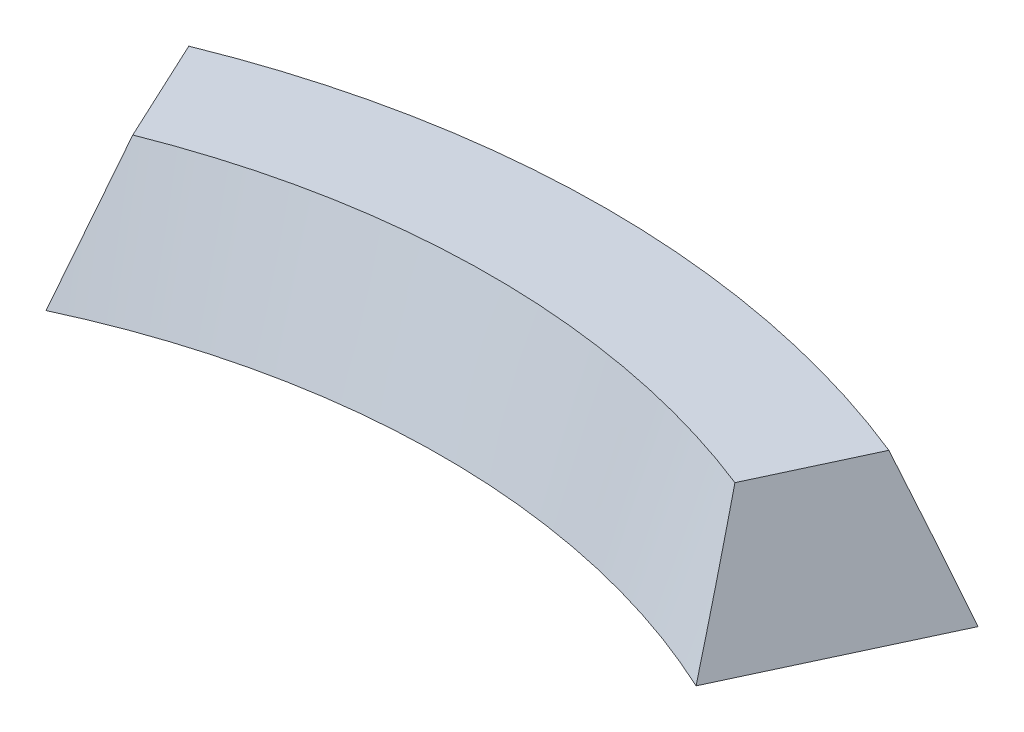
ISO-10303-21;
HEADER;
FILE_DESCRIPTION(('STEP AP214'),'2;1');
FILE_NAME('part.step','',(''),(''),'','','');
FILE_SCHEMA(('AUTOMOTIVE_DESIGN { 1 0 10303 214 1 1 1 1 }'));
ENDSEC;
DATA;
#1=APPLICATION_CONTEXT('core data for automotive mechanical design processes');
#2=APPLICATION_PROTOCOL_DEFINITION('international standard','automotive_design',2000,#1);
#3=PRODUCT_CONTEXT('',#1,'mechanical');
#4=PRODUCT('Part','Part','',(#3));
#5=PRODUCT_RELATED_PRODUCT_CATEGORY('part','',(#4));
#6=PRODUCT_DEFINITION_FORMATION('','',#4);
#7=PRODUCT_DEFINITION_CONTEXT('part definition',#1,'design');
#8=PRODUCT_DEFINITION('design','',#6,#7);
#9=PRODUCT_DEFINITION_SHAPE('','',#8);
#10=(LENGTH_UNIT() NAMED_UNIT(*) SI_UNIT(.MILLI.,.METRE.));
#11=(NAMED_UNIT(*) PLANE_ANGLE_UNIT() SI_UNIT($,.RADIAN.));
#12=(NAMED_UNIT(*) SI_UNIT($,.STERADIAN.) SOLID_ANGLE_UNIT());
#13=UNCERTAINTY_MEASURE_WITH_UNIT(LENGTH_MEASURE(1.E-05),#10,'distance_accuracy_value','');
#14=(GEOMETRIC_REPRESENTATION_CONTEXT(3) GLOBAL_UNCERTAINTY_ASSIGNED_CONTEXT((#13)) GLOBAL_UNIT_ASSIGNED_CONTEXT((#10,
#11,#12)) REPRESENTATION_CONTEXT('',''));
#15=CARTESIAN_POINT('',(0.,0.,0.));
#16=DIRECTION('',(0.,0.,1.));
#17=DIRECTION('',(1.,0.,0.));
#18=AXIS2_PLACEMENT_3D('',#15,#16,#17);
#19=CARTESIAN_POINT('',(0.589963547082204,0.,-0.0341777324113987));
#20=DIRECTION('',(0.,1.,0.));
#21=DIRECTION('',(0.,0.,1.));
#22=AXIS2_PLACEMENT_3D('',#19,#20,#21);
#23=CONICAL_SURFACE('',#22,29.,0.349065850398867);
#24=CARTESIAN_POINT('',(0.589963547082204,0.,-0.0341777324113987));
#25=DIRECTION('',(0.,-1.,0.));
#26=DIRECTION('',(0.,0.,1.));
#27=AXIS2_PLACEMENT_3D('',#24,#25,#26);
#28=CIRCLE('',#27,29.);
#29=CARTESIAN_POINT('',(-11.6659660433982,0.,-26.3171035564742));
#30=VERTEX_POINT('',#29);
#31=CARTESIAN_POINT('',(12.8458931375624,0.,-26.3171035564743));
#32=VERTEX_POINT('',#31);
#33=EDGE_CURVE('E90',#30,#32,#28,.T.);
#34=ORIENTED_EDGE('',*,*,#33,.T.);
#35=CARTESIAN_POINT('',(11.9429233759532,5.,-28.6868133763977));
#36=CARTESIAN_POINT('',(12.0201744774668,4.5821499105554,-28.4926151424022));
#37=CARTESIAN_POINT('',(12.0969521472205,4.16457402183559,-28.2976377797735));
#38=CARTESIAN_POINT('',(12.2495187007762,3.33000939510871,-27.9060682662137));
#39=CARTESIAN_POINT('',(12.3253076038402,2.91302064580524,-27.7094761468617));
#40=CARTESIAN_POINT('',(12.475857837761,2.07965208330693,-27.3146127046322));
#41=CARTESIAN_POINT('',(12.5506191669977,1.66327227107311,-27.1163413791081));
#42=CARTESIAN_POINT('',(12.6990709051893,0.831148551294612,-26.7180497903567));
#43=CARTESIAN_POINT('',(12.7727612932206,0.415404656315828,-26.5180294930807));
#44=CARTESIAN_POINT('',(12.8458931375624,0.,-26.3171035564743));
#45=B_SPLINE_CURVE_WITH_KNOTS('',3,(#35,#36,#37,#38,#39,#40,#41,#42,#43,#44),.UNSPECIFIED.,.F.,
.F.,(4,2,2,2,4),(0.,1.40161089254119,2.8031944395412,4.20478019613413,5.60639329961415),.UNSPECIFIED.);
#46=CARTESIAN_POINT('',(11.9429233759532,5.,-28.6868133763977));
#47=VERTEX_POINT('',#46);
#48=EDGE_CURVE('E11',#47,#32,#45,.T.);
#49=ORIENTED_EDGE('',*,*,#48,.F.);
#50=CARTESIAN_POINT('',(0.589963547082204,5.,-0.0341777324113987));
#51=DIRECTION('',(0.,1.,0.));
#52=DIRECTION('',(0.,0.,1.));
#53=AXIS2_PLACEMENT_3D('',#50,#51,#52);
#54=CIRCLE('',#53,30.819851171331);
#55=CARTESIAN_POINT('',(-10.762996281789,5.,-28.6868133763976));
#56=VERTEX_POINT('',#55);
#57=EDGE_CURVE('E107',#56,#47,#54,.F.);
#58=ORIENTED_EDGE('',*,*,#57,.F.);
#59=CARTESIAN_POINT('',(-10.762996281789,5.,-28.6868133763976));
#60=CARTESIAN_POINT('',(-10.8402473833027,4.5821499105554,-28.4926151424021));
#61=CARTESIAN_POINT('',(-10.9170250530563,4.16457402183559,-28.2976377797734));
#62=CARTESIAN_POINT('',(-11.069591606612,3.33000939510871,-27.9060682662136));
#63=CARTESIAN_POINT('',(-11.145380509676,2.91302064580524,-27.7094761468616));
#64=CARTESIAN_POINT('',(-11.2959307435968,2.07965208330693,-27.3146127046321));
#65=CARTESIAN_POINT('',(-11.3706920728335,1.66327227107311,-27.116341379108));
#66=CARTESIAN_POINT('',(-11.5191438110251,0.831148551294612,-26.7180497903566));
#67=CARTESIAN_POINT('',(-11.5928341990564,0.415404656315828,-26.5180294930806));
#68=CARTESIAN_POINT('',(-11.6659660433982,0.,-26.3171035564742));
#69=B_SPLINE_CURVE_WITH_KNOTS('',3,(#59,#60,#61,#62,#63,#64,#65,#66,#67,#68),.UNSPECIFIED.,.F.,
.F.,(4,2,2,2,4),(0.,1.40161089254119,2.8031944395412,4.20478019613413,5.60639329961415),.UNSPECIFIED.);
#70=EDGE_CURVE('E102',#56,#30,#69,.T.);
#71=ORIENTED_EDGE('',*,*,#70,.T.);
#72=EDGE_LOOP('',(#34,#49,#58,#71));
#73=FACE_BOUND('',#72,.T.);
#74=ADVANCED_FACE('F43',(#73),#23,.F.);
#75=CARTESIAN_POINT('',(12.8458931375624,0.,-26.3171035564743));
#76=DIRECTION('',(0.851650739639147,0.342020143325669,0.3971312619671));
#77=DIRECTION('',(0.422618261740697,0.,-0.906307787036651));
#78=AXIS2_PLACEMENT_3D('',#75,#76,#77);
#79=PLANE('',#78);
#80=DIRECTION('',(0.422618261740697,0.,-0.906307787036651));
#81=VECTOR('',#80,1.);
#82=CARTESIAN_POINT('',(12.8458931375624,0.,-26.3171035564743));
#83=LINE('',#82,#81);
#84=CARTESIAN_POINT('',(16.226839231488,0.,-33.5675658527675));
#85=VERTEX_POINT('',#84);
#86=EDGE_CURVE('E86',#32,#85,#83,.T.);
#87=ORIENTED_EDGE('',*,*,#86,.T.);
#88=CARTESIAN_POINT('',(13.7884856432724,5.,-32.6446344308951));
#89=CARTESIAN_POINT('',(13.9928304956892,4.58454903512535,-32.7250558159879));
#90=CARTESIAN_POINT('',(14.1968775826535,4.16877438170897,-32.8045598717132));
#91=CARTESIAN_POINT('',(14.6043895734434,3.33661312151177,-32.9617924566677));
#92=CARTESIAN_POINT('',(14.8078544867297,2.92022652484374,-33.0395210148949));
#93=CARTESIAN_POINT('',(15.2142219315946,2.08686368088397,-33.1932642768798));
#94=CARTESIAN_POINT('',(15.4171244637952,1.66988743424524,-33.269278982534));
#95=CARTESIAN_POINT('',(15.8223862529974,0.835363867117629,-33.4196515122314));
#96=CARTESIAN_POINT('',(16.0247455010657,0.417816537406679,-33.4940093091748));
#97=CARTESIAN_POINT('',(16.226839231488,0.,-33.5675658527675));
#98=B_SPLINE_CURVE_WITH_KNOTS('',3,(#88,#89,#90,#91,#92,#93,#94,#95,#96,#97),.UNSPECIFIED.,.F.,
.F.,(4,2,2,2,4),(0.,1.40975563739738,2.81948823386623,4.22921927037579,5.63897334709168),.UNSPECIFIED.);
#99=CARTESIAN_POINT('',(13.7884856432724,5.,-32.6446344308951));
#100=VERTEX_POINT('',#99);
#101=EDGE_CURVE('E53',#100,#85,#98,.T.);
#102=ORIENTED_EDGE('',*,*,#101,.F.);
#103=DIRECTION('',(-0.422618261740697,0.,0.906307787036651));
#104=VECTOR('',#103,1.);
#105=CARTESIAN_POINT('',(11.1965478497374,5.,-27.086205895129));
#106=LINE('',#105,#104);
#107=EDGE_CURVE('E98',#47,#100,#106,.F.);
#108=ORIENTED_EDGE('',*,*,#107,.F.);
#109=ORIENTED_EDGE('',*,*,#48,.T.);
#110=EDGE_LOOP('',(#87,#102,#108,#109));
#111=FACE_BOUND('',#110,.T.);
#112=ADVANCED_FACE('F97',(#111),#79,.T.);
#113=CARTESIAN_POINT('',(0.589963547082204,0.,-0.0341777324113987));
#114=DIRECTION('',(0.,-1.,0.));
#115=DIRECTION('',(0.,0.,1.));
#116=AXIS2_PLACEMENT_3D('',#113,#114,#115);
#117=CONICAL_SURFACE('',#116,37.,0.349065850398867);
#118=CARTESIAN_POINT('',(0.589963547082204,0.,-0.0341777324113987));
#119=DIRECTION('',(0.,1.,0.));
#120=DIRECTION('',(0.,0.,1.));
#121=AXIS2_PLACEMENT_3D('',#118,#119,#120);
#122=CIRCLE('',#121,37.);
#123=CARTESIAN_POINT('',(-15.0469121373238,0.,-33.5675658527674));
#124=VERTEX_POINT('',#123);
#125=EDGE_CURVE('E91',#85,#124,#122,.T.);
#126=ORIENTED_EDGE('',*,*,#125,.T.);
#127=CARTESIAN_POINT('',(-12.6085585491082,5.,-32.644634430895));
#128=CARTESIAN_POINT('',(-12.8129034015251,4.58454903512535,-32.7250558159878));
#129=CARTESIAN_POINT('',(-13.0169504884893,4.16877438170897,-32.8045598717131));
#130=CARTESIAN_POINT('',(-13.4244624792792,3.33661312151177,-32.9617924566676));
#131=CARTESIAN_POINT('',(-13.6279273925656,2.92022652484374,-33.0395210148948));
#132=CARTESIAN_POINT('',(-14.0342948374304,2.08686368088397,-33.1932642768797));
#133=CARTESIAN_POINT('',(-14.237197369631,1.66988743424524,-33.2692789825339));
#134=CARTESIAN_POINT('',(-14.6424591588332,0.835363867117626,-33.4196515122313));
#135=CARTESIAN_POINT('',(-14.8448184069016,0.417816537406676,-33.4940093091747));
#136=CARTESIAN_POINT('',(-15.0469121373238,0.,-33.5675658527674));
#137=B_SPLINE_CURVE_WITH_KNOTS('',3,(#127,#128,#129,#130,#131,#132,#133,#134,#135,#136),
.UNSPECIFIED.,.F.,.F.,(4,2,2,2,4),(0.,1.40975563739738,2.81948823386623,4.2292192703758,
5.63897334709169),.UNSPECIFIED.);
#138=CARTESIAN_POINT('',(-12.6085585491082,5.,-32.644634430895));
#139=VERTEX_POINT('',#138);
#140=EDGE_CURVE('E131',#139,#124,#137,.T.);
#141=ORIENTED_EDGE('',*,*,#140,.F.);
#142=CARTESIAN_POINT('',(0.589963547082204,5.,-0.0341777324113987));
#143=DIRECTION('',(0.,1.,0.));
#144=DIRECTION('',(0.,0.,1.));
#145=AXIS2_PLACEMENT_3D('',#142,#143,#144);
#146=CIRCLE('',#145,35.180148828669);
#147=EDGE_CURVE('E65',#100,#139,#146,.T.);
#148=ORIENTED_EDGE('',*,*,#147,.F.);
#149=ORIENTED_EDGE('',*,*,#101,.T.);
#150=EDGE_LOOP('',(#126,#141,#148,#149));
#151=FACE_BOUND('',#150,.T.);
#152=ADVANCED_FACE('F45',(#151),#117,.T.);
#153=CARTESIAN_POINT('',(-11.6659660433982,0.,-26.3171035564742));
#154=DIRECTION('',(-0.851650739639144,0.342020143325669,0.397131261967107));
#155=DIRECTION('',(0.422618261740704,0.,0.906307787036648));
#156=AXIS2_PLACEMENT_3D('',#153,#154,#155);
#157=PLANE('',#156);
#158=DIRECTION('',(0.422618261740704,0.,0.906307787036648));
#159=VECTOR('',#158,1.);
#160=CARTESIAN_POINT('',(-11.6659660433982,0.,-26.3171035564742));
#161=LINE('',#160,#159);
#162=EDGE_CURVE('E106',#124,#30,#161,.T.);
#163=ORIENTED_EDGE('',*,*,#162,.T.);
#164=ORIENTED_EDGE('',*,*,#70,.F.);
#165=DIRECTION('',(-0.422618261740704,0.,-0.906307787036648));
#166=VECTOR('',#165,1.);
#167=CARTESIAN_POINT('',(-10.0166207555731,5.,-27.0862058951289));
#168=LINE('',#167,#166);
#169=EDGE_CURVE('E48',#139,#56,#168,.F.);
#170=ORIENTED_EDGE('',*,*,#169,.F.);
#171=ORIENTED_EDGE('',*,*,#140,.T.);
#172=EDGE_LOOP('',(#163,#164,#170,#171));
#173=FACE_BOUND('',#172,.T.);
#174=ADVANCED_FACE('F124',(#173),#157,.T.);
#175=CARTESIAN_POINT('',(0.589963547082204,5.,-0.0341777324113987));
#176=DIRECTION('',(0.,1.,0.));
#177=DIRECTION('',(0.,0.,1.));
#178=AXIS2_PLACEMENT_3D('',#175,#176,#177);
#179=PLANE('',#178);
#180=ORIENTED_EDGE('',*,*,#57,.T.);
#181=ORIENTED_EDGE('',*,*,#107,.T.);
#182=ORIENTED_EDGE('',*,*,#147,.T.);
#183=ORIENTED_EDGE('',*,*,#169,.T.);
#184=EDGE_LOOP('',(#180,#181,#182,#183));
#185=FACE_BOUND('',#184,.T.);
#186=ADVANCED_FACE('F128',(#185),#179,.T.);
#187=CARTESIAN_POINT('',(0.589963547082204,0.,-0.0341777324113987));
#188=DIRECTION('',(0.,1.,0.));
#189=DIRECTION('',(0.,0.,1.));
#190=AXIS2_PLACEMENT_3D('',#187,#188,#189);
#191=PLANE('',#190);
#192=ORIENTED_EDGE('',*,*,#33,.F.);
#193=ORIENTED_EDGE('',*,*,#162,.F.);
#194=ORIENTED_EDGE('',*,*,#125,.F.);
#195=ORIENTED_EDGE('',*,*,#86,.F.);
#196=EDGE_LOOP('',(#192,#193,#194,#195));
#197=FACE_BOUND('',#196,.T.);
#198=ADVANCED_FACE('F87',(#197),#191,.F.);
#199=CLOSED_SHELL('',(#74,#112,#152,#174,#186,#198));
#200=MANIFOLD_SOLID_BREP('B2',#199);
#201=ADVANCED_BREP_SHAPE_REPRESENTATION('',(#18,#200),#14);
#202=SHAPE_DEFINITION_REPRESENTATION(#9,#201);
ENDSEC;
END-ISO-10303-21;
